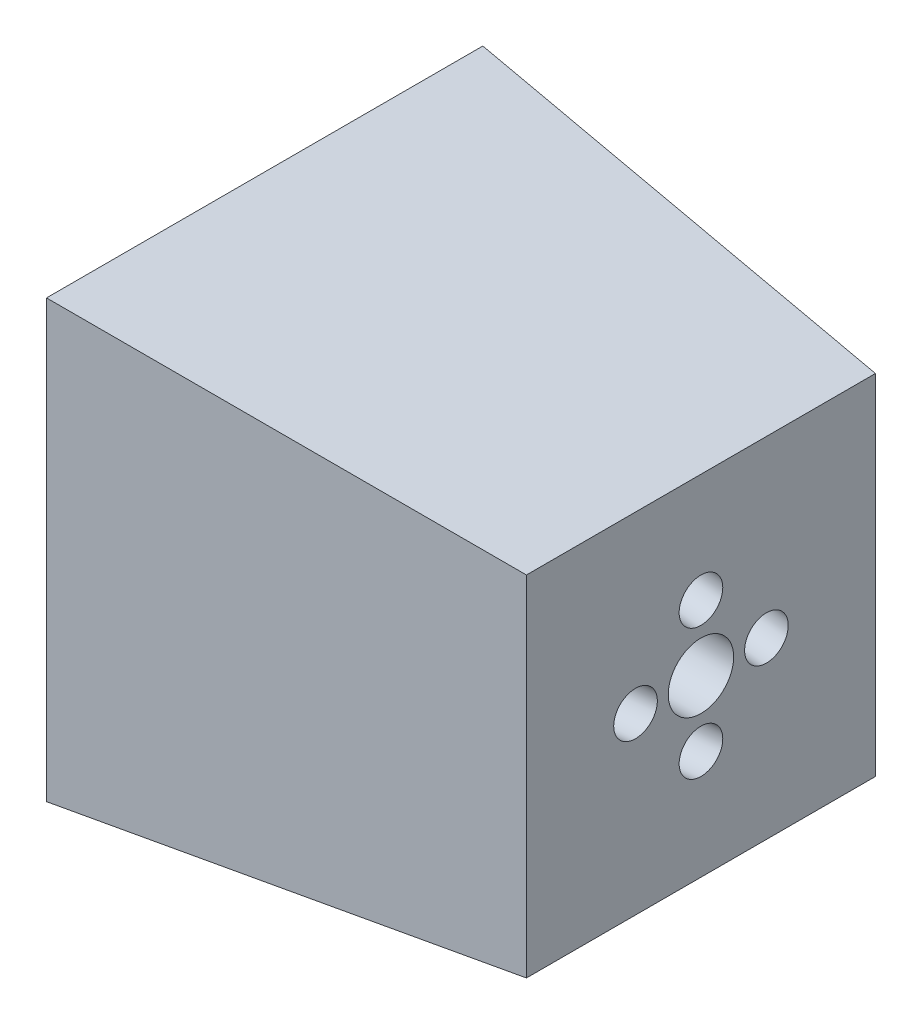
ISO-10303-21;
HEADER;
FILE_DESCRIPTION(('STEP AP214'),'2;1');
FILE_NAME('part.step','',(''),(''),'','','');
FILE_SCHEMA(('AUTOMOTIVE_DESIGN { 1 0 10303 214 1 1 1 1 }'));
ENDSEC;
DATA;
#1=APPLICATION_CONTEXT('core data for automotive mechanical design processes');
#2=APPLICATION_PROTOCOL_DEFINITION('international standard','automotive_design',2000,#1);
#3=PRODUCT_CONTEXT('',#1,'mechanical');
#4=PRODUCT('Part','Part','',(#3));
#5=PRODUCT_RELATED_PRODUCT_CATEGORY('part','',(#4));
#6=PRODUCT_DEFINITION_FORMATION('','',#4);
#7=PRODUCT_DEFINITION_CONTEXT('part definition',#1,'design');
#8=PRODUCT_DEFINITION('design','',#6,#7);
#9=PRODUCT_DEFINITION_SHAPE('','',#8);
#10=(LENGTH_UNIT() NAMED_UNIT(*) SI_UNIT(.MILLI.,.METRE.));
#11=(NAMED_UNIT(*) PLANE_ANGLE_UNIT() SI_UNIT($,.RADIAN.));
#12=(NAMED_UNIT(*) SI_UNIT($,.STERADIAN.) SOLID_ANGLE_UNIT());
#13=UNCERTAINTY_MEASURE_WITH_UNIT(LENGTH_MEASURE(1.E-05),#10,'distance_accuracy_value','');
#14=(GEOMETRIC_REPRESENTATION_CONTEXT(3) GLOBAL_UNCERTAINTY_ASSIGNED_CONTEXT((#13)) GLOBAL_UNIT_ASSIGNED_CONTEXT((#10,
#11,#12)) REPRESENTATION_CONTEXT('',''));
#15=CARTESIAN_POINT('',(0.,0.,0.));
#16=DIRECTION('',(0.,0.,1.));
#17=DIRECTION('',(1.,0.,0.));
#18=AXIS2_PLACEMENT_3D('',#15,#16,#17);
#19=CARTESIAN_POINT('',(-100.,0.,0.));
#20=DIRECTION('',(-1.,0.,0.));
#21=DIRECTION('',(0.,0.,1.));
#22=AXIS2_PLACEMENT_3D('',#19,#20,#21);
#23=PLANE('',#22);
#24=CARTESIAN_POINT('',(-100.,0.,0.));
#25=DIRECTION('',(-1.,0.,0.));
#26=DIRECTION('',(0.,0.,1.));
#27=AXIS2_PLACEMENT_3D('',#24,#25,#26);
#28=CIRCLE('',#27,7.5);
#29=CARTESIAN_POINT('',(-100.,0.,7.5));
#30=VERTEX_POINT('',#29);
#31=EDGE_CURVE('E261',#30,#30,#28,.T.);
#32=ORIENTED_EDGE('',*,*,#31,.F.);
#33=EDGE_LOOP('',(#32));
#34=FACE_BOUND('',#33,.T.);
#35=CARTESIAN_POINT('',(-100.,0.,30.));
#36=CARTESIAN_POINT('',(-100.,0.1385285597722,30.0000003298171));
#37=CARTESIAN_POINT('',(-100.,0.277059840437409,29.9942395939713));
#38=CARTESIAN_POINT('',(-100.,0.553216965321283,29.9712328197264));
#39=CARTESIAN_POINT('',(-100.,0.690842445484033,29.9539824179015));
#40=CARTESIAN_POINT('',(-100.,0.964134984880487,29.9081192702556));
#41=CARTESIAN_POINT('',(-100.,1.09980274929102,29.8795107271997));
#42=CARTESIAN_POINT('',(-100.,1.36834298276902,29.8111165305056));
#43=CARTESIAN_POINT('',(-100.,1.50121442896932,29.7713268607555));
#44=CARTESIAN_POINT('',(-100.,1.76314651576361,29.6808658808765));
#45=CARTESIAN_POINT('',(-100.,1.89220850790447,29.6301984841238));
#46=CARTESIAN_POINT('',(-100.,2.14572590134344,29.5183033445398));
#47=CARTESIAN_POINT('',(-100.,2.27017963256984,29.4570718178089));
#48=CARTESIAN_POINT('',(-100.,2.51352792657696,29.3245078801161));
#49=CARTESIAN_POINT('',(-100.,2.63242446784614,29.2531791010129));
#50=CARTESIAN_POINT('',(-100.,2.86392672172822,29.1008692351718));
#51=CARTESIAN_POINT('',(-100.,2.97653016135156,29.0198846935649));
#52=CARTESIAN_POINT('',(-100.,3.19458281353073,28.8488740810886));
#53=CARTESIAN_POINT('',(-100.,3.30003457819726,28.7588512643216));
#54=CARTESIAN_POINT('',(-100.,3.50313654992571,28.570327584903));
#55=CARTESIAN_POINT('',(-100.,3.60078394357853,28.4718236912399));
#56=CARTESIAN_POINT('',(-100.,3.78752676708732,28.2670831077229));
#57=CARTESIAN_POINT('',(-100.,3.87662525240745,28.1608492047004));
#58=CARTESIAN_POINT('',(-100.,4.0457251141882,27.9413114512762));
#59=CARTESIAN_POINT('',(-100.,4.12572321439968,27.8280050772917));
#60=CARTESIAN_POINT('',(-100.,4.27600558810493,27.5951815442083));
#61=CARTESIAN_POINT('',(-100.,4.34629333615362,27.4756666278215));
#62=CARTESIAN_POINT('',(-100.,4.47672708609248,27.2311699564562));
#63=CARTESIAN_POINT('',(-100.,4.53686943925657,27.1061862549297));
#64=CARTESIAN_POINT('',(-100.,4.64654636397009,26.8517013366476));
#65=CARTESIAN_POINT('',(-100.,4.69608473333762,26.7222017566435));
#66=CARTESIAN_POINT('',(-100.,4.7842548584075,26.4594898104109));
#67=CARTESIAN_POINT('',(-100.,4.82288269356029,26.3262761284153));
#68=CARTESIAN_POINT('',(-100.,4.88892903017654,26.0571485181558));
#69=CARTESIAN_POINT('',(-100.,4.91635154803485,25.9212355757545));
#70=CARTESIAN_POINT('',(-100.,4.95982657169531,25.6475555997026));
#71=CARTESIAN_POINT('',(-100.,4.97587499349174,25.5097879181601));
#72=CARTESIAN_POINT('',(-100.,4.99646769365315,25.2334356954908));
#73=CARTESIAN_POINT('',(-100.,5.00101609708246,25.0948514651447));
#74=CARTESIAN_POINT('',(-100.,4.99860214578275,24.8177699306864));
#75=CARTESIAN_POINT('',(-100.,4.99163565948306,24.6792726756194));
#76=CARTESIAN_POINT('',(-100.,4.953482728418,24.2654535252476));
#77=CARTESIAN_POINT('',(-100.,4.90506430050005,23.9915124524441));
#78=CARTESIAN_POINT('',(-100.,4.7635758305878,23.4555680393227));
#79=CARTESIAN_POINT('',(-100.,4.67050578859349,23.1935646990047));
#80=CARTESIAN_POINT('',(-100.,4.44228191414583,22.6885353161968));
#81=CARTESIAN_POINT('',(-100.,4.30712808169248,22.4455092737069));
#82=CARTESIAN_POINT('',(-100.,3.9984641314033,21.9851875392002));
#83=CARTESIAN_POINT('',(-100.,3.82495401356748,21.7678918471833));
#84=CARTESIAN_POINT('',(-100.,3.44436319647967,21.3650107092301));
#85=CARTESIAN_POINT('',(-100.,3.23728249722768,21.1794252632938));
#86=CARTESIAN_POINT('',(-100.,2.79526206835771,20.8450869106089));
#87=CARTESIAN_POINT('',(-100.,2.56032233873973,20.6963340038604));
#88=CARTESIAN_POINT('',(-100.,2.06906381021704,20.4397625736148));
#89=CARTESIAN_POINT('',(-100.,1.81274501131234,20.3319440501178));
#90=CARTESIAN_POINT('',(-100.,1.28579796366701,20.1602154257565));
#91=CARTESIAN_POINT('',(-100.,1.01516971492638,20.0963053248923));
#92=CARTESIAN_POINT('',(-100.,0.467068062566381,20.0141562040276));
#93=CARTESIAN_POINT('',(-100.,0.189594658947005,19.9959171840272));
#94=CARTESIAN_POINT('',(-100.,-0.364544209932437,20.0056133003615));
#95=CARTESIAN_POINT('',(-100.,-0.641209675192503,20.0335484366962));
#96=CARTESIAN_POINT('',(-100.,-1.18610185804873,20.1348223717362));
#97=CARTESIAN_POINT('',(-100.,-1.45432857564489,20.2081611704414));
#98=CARTESIAN_POINT('',(-100.,-1.97494520601807,20.39821964788));
#99=CARTESIAN_POINT('',(-100.,-2.22733511879508,20.5149393266133));
#100=CARTESIAN_POINT('',(-100.,-2.70931688295294,20.7885402764902));
#101=CARTESIAN_POINT('',(-100.,-2.9389087343338,20.9454215476337));
#102=CARTESIAN_POINT('',(-100.,-3.36896192062004,21.2950186839019));
#103=CARTESIAN_POINT('',(-100.,-3.56942325552542,21.4877345490265));
#104=CARTESIAN_POINT('',(-100.,-3.93568641299086,21.9036855079341));
#105=CARTESIAN_POINT('',(-100.,-4.10148823555092,22.126920601717));
#106=CARTESIAN_POINT('',(-100.,-4.39385932887064,22.5977528908831));
#107=CARTESIAN_POINT('',(-100.,-4.52042859963031,22.8453500862662));
#108=CARTESIAN_POINT('',(-100.,-4.73084363698726,23.3580775116863));
#109=CARTESIAN_POINT('',(-100.,-4.81468940358455,23.6232077417231));
#110=CARTESIAN_POINT('',(-100.,-4.9373448524081,24.1636885847121));
#111=CARTESIAN_POINT('',(-100.,-4.97615453463438,24.4390391976642));
#112=CARTESIAN_POINT('',(-100.,-5.00766739131245,24.9923662622782));
#113=CARTESIAN_POINT('',(-100.,-5.00037056576426,25.2703427139401));
#114=CARTESIAN_POINT('',(-100.,-4.93987166197812,25.8212544891561));
#115=CARTESIAN_POINT('',(-100.,-4.88666958374017,26.0941898127102));
#116=CARTESIAN_POINT('',(-100.,-4.73582756490298,26.627491400135));
#117=CARTESIAN_POINT('',(-100.,-4.63818762430373,26.8878576640057));
#118=CARTESIAN_POINT('',(-100.,-4.40116290516969,27.3888398943106));
#119=CARTESIAN_POINT('',(-100.,-4.26177812663489,27.6294558607448));
#120=CARTESIAN_POINT('',(-100.,-3.94510821935052,28.0843009160245));
#121=CARTESIAN_POINT('',(-100.,-3.76782309060096,28.29853000487));
#122=CARTESIAN_POINT('',(-100.,-3.38024200036277,28.69469281836));
#123=CARTESIAN_POINT('',(-100.,-3.16994603887416,28.8766265430046));
#124=CARTESIAN_POINT('',(-100.,-2.72214445377659,29.2031797434366));
#125=CARTESIAN_POINT('',(-100.,-2.48463883016764,29.3477992192241));
#126=CARTESIAN_POINT('',(-100.,-1.98896520609131,29.5957384995294));
#127=CARTESIAN_POINT('',(-100.,-1.73079720562393,29.6990583040472));
#128=CARTESIAN_POINT('',(-100.,-1.23138937391067,29.8521965812933));
#129=CARTESIAN_POINT('',(-100.,-0.991615447864765,29.9068001624825));
#130=CARTESIAN_POINT('',(-100.,-0.625689194239153,29.9622760170203));
#131=CARTESIAN_POINT('',(-100.,-0.501414470705671,29.9763662784638));
#132=CARTESIAN_POINT('',(-100.,-0.251430006043848,29.9952547298808));
#133=CARTESIAN_POINT('',(-100.,-0.125716123452088,29.9999997006875));
#134=CARTESIAN_POINT('',(-100.,0.,30.));
#135=B_SPLINE_CURVE_WITH_KNOTS('',3,(#35,#36,#37,#38,#39,#40,#41,#42,#43,#44,#45,#46,#47,#48,
#49,#50,#51,#52,#53,#54,#55,#56,#57,#58,#59,#60,#61,#62,#63,#64,#65,#66,#67,#68,#69,#70,#71,#72,
#73,#74,#75,#76,#77,#78,#79,#80,#81,#82,#83,#84,#85,#86,#87,#88,#89,#90,#91,#92,#93,#94,#95,#96,
#97,#98,#99,#100,#101,#102,#103,#104,#105,#106,#107,#108,#109,#110,#111,#112,#113,#114,#115,
#116,#117,#118,#119,#120,#121,#122,#123,#124,#125,#126,#127,#128,#129,#130,#131,#132,#133,#134),
.UNSPECIFIED.,.T.,.F.,(4,2,2,2,2,2,2,2,2,2,2,2,2,2,2,2,2,2,2,2,2,2,2,2,2,2,2,2,2,2,2,2,2,2,2,2,
2,2,2,2,2,2,2,2,2,2,2,2,2,4),(0.,0.415470913561702,0.831099700376822,1.24657483840776,
1.66219940075635,2.07767468763347,2.49329910113596,2.90877439766641,3.32439880151558,
3.73987409870045,4.15549850189521,4.57097379912327,4.98659820227483,5.40207349950564,
5.81769790265445,6.23317319988543,6.64879760303407,7.06427290026507,7.4798973034137,
7.89537260064469,8.31099700379332,9.14137881569243,9.97176062759153,10.8021424394906,
11.6325242513897,12.4629060632889,13.293287875188,14.1236696870871,14.9540514989862,
15.7844333108853,16.6148151227844,17.4451969346835,18.2755787465826,19.1059605584817,
19.9363423703808,20.7667241822799,21.597105994179,22.4274878060781,23.2578696179772,
24.0882514298763,24.9186332417755,25.7490150536746,26.5793968655737,27.4097786774728,
28.2401604893719,29.070542301271,29.9009241131701,30.6358438530342,31.0107591240888,
31.3878033433167),.UNSPECIFIED.);
#136=CARTESIAN_POINT('',(-100.,0.,30.));
#137=VERTEX_POINT('',#136);
#138=EDGE_CURVE('E265',#137,#137,#135,.T.);
#139=ORIENTED_EDGE('',*,*,#138,.F.);
#140=EDGE_LOOP('',(#139));
#141=FACE_BOUND('',#140,.T.);
#142=CARTESIAN_POINT('',(-100.,25.,-5.));
#143=CARTESIAN_POINT('',(-100.,25.1385285597722,-5.00000032981713));
#144=CARTESIAN_POINT('',(-100.,25.2770598404374,-4.99423959397131));
#145=CARTESIAN_POINT('',(-100.,25.5532169653213,-4.9712328197264));
#146=CARTESIAN_POINT('',(-100.,25.690842445484,-4.95398241790152));
#147=CARTESIAN_POINT('',(-100.,25.9641349848805,-4.90811927025558));
#148=CARTESIAN_POINT('',(-100.,26.099802749291,-4.87951072719966));
#149=CARTESIAN_POINT('',(-100.,26.368342982769,-4.81111653050565));
#150=CARTESIAN_POINT('',(-100.,26.5012144289693,-4.77132686075554));
#151=CARTESIAN_POINT('',(-100.,26.7631465157636,-4.68086588087653));
#152=CARTESIAN_POINT('',(-100.,26.8922085079045,-4.63019848412383));
#153=CARTESIAN_POINT('',(-100.,27.1457259013434,-4.51830334453981));
#154=CARTESIAN_POINT('',(-100.,27.2701796325698,-4.45707181780893));
#155=CARTESIAN_POINT('',(-100.,27.513527926577,-4.32450788011613));
#156=CARTESIAN_POINT('',(-100.,27.6324244678461,-4.25317910101292));
#157=CARTESIAN_POINT('',(-100.,27.8639267217282,-4.10086923517183));
#158=CARTESIAN_POINT('',(-100.,27.9765301613516,-4.01988469356487));
#159=CARTESIAN_POINT('',(-100.,28.1945828135307,-3.84887408108859));
#160=CARTESIAN_POINT('',(-100.,28.3000345781973,-3.75885126432159));
#161=CARTESIAN_POINT('',(-100.,28.5031365499257,-3.57032758490296));
#162=CARTESIAN_POINT('',(-100.,28.6007839435785,-3.47182369123993));
#163=CARTESIAN_POINT('',(-100.,28.7875267670873,-3.26708310772286));
#164=CARTESIAN_POINT('',(-100.,28.8766252524075,-3.16084920470042));
#165=CARTESIAN_POINT('',(-100.,29.0457251141882,-2.94131145127625));
#166=CARTESIAN_POINT('',(-100.,29.1257232143997,-2.82800507729167));
#167=CARTESIAN_POINT('',(-100.,29.2760055881049,-2.59518154420831));
#168=CARTESIAN_POINT('',(-100.,29.3462933361536,-2.47566662782149));
#169=CARTESIAN_POINT('',(-100.,29.4767270860925,-2.23116995645618));
#170=CARTESIAN_POINT('',(-100.,29.5368694392566,-2.10618625492971));
#171=CARTESIAN_POINT('',(-100.,29.6465463639701,-1.85170133664759));
#172=CARTESIAN_POINT('',(-100.,29.6960847333376,-1.72220175664349));
#173=CARTESIAN_POINT('',(-100.,29.7842548584075,-1.45948981041091));
#174=CARTESIAN_POINT('',(-100.,29.8228826935603,-1.32627612841534));
#175=CARTESIAN_POINT('',(-100.,29.8889290301766,-1.05714851815583));
#176=CARTESIAN_POINT('',(-100.,29.9163515480349,-0.921235575754491));
#177=CARTESIAN_POINT('',(-100.,29.9598265716953,-0.647555599702637));
#178=CARTESIAN_POINT('',(-100.,29.9758749934917,-0.509787918160133));
#179=CARTESIAN_POINT('',(-100.,29.9964676936532,-0.233435695490765));
#180=CARTESIAN_POINT('',(-100.,30.0010160970825,-0.0948514651446539));
#181=CARTESIAN_POINT('',(-100.,29.9986021457828,0.182230069313587));
#182=CARTESIAN_POINT('',(-100.,29.9916356594831,0.32072732438063));
#183=CARTESIAN_POINT('',(-100.,29.953482728418,0.734546474752419));
#184=CARTESIAN_POINT('',(-100.,29.9050643005001,1.00848754755588));
#185=CARTESIAN_POINT('',(-100.,29.7635758305878,1.54443196067731));
#186=CARTESIAN_POINT('',(-100.,29.6705057885935,1.80643530099529));
#187=CARTESIAN_POINT('',(-100.,29.4422819141458,2.31146468380316));
#188=CARTESIAN_POINT('',(-100.,29.3071280816925,2.55449072629306));
#189=CARTESIAN_POINT('',(-100.,28.9984641314033,3.01481246079981));
#190=CARTESIAN_POINT('',(-100.,28.8249540135675,3.23210815281666));
#191=CARTESIAN_POINT('',(-100.,28.4443631964797,3.63498929076987));
#192=CARTESIAN_POINT('',(-100.,28.2372824972277,3.82057473670622));
#193=CARTESIAN_POINT('',(-100.,27.7952620683577,4.15491308939111));
#194=CARTESIAN_POINT('',(-100.,27.5603223387397,4.30366599613965));
#195=CARTESIAN_POINT('',(-100.,27.069063810217,4.5602374263852));
#196=CARTESIAN_POINT('',(-100.,26.8127450113123,4.66805594988221));
#197=CARTESIAN_POINT('',(-100.,26.285797963667,4.83978457424347));
#198=CARTESIAN_POINT('',(-100.,26.0151697149264,4.90369467510771));
#199=CARTESIAN_POINT('',(-100.,25.4670680625664,4.9858437959724));
#200=CARTESIAN_POINT('',(-100.,25.189594658947,5.00408281597285));
#201=CARTESIAN_POINT('',(-100.,24.6354557900675,4.99438669963854));
#202=CARTESIAN_POINT('',(-100.,24.3587903248075,4.96645156330378));
#203=CARTESIAN_POINT('',(-100.,23.8138981419512,4.86517762826379));
#204=CARTESIAN_POINT('',(-100.,23.5456714243551,4.79183882955855));
#205=CARTESIAN_POINT('',(-100.,23.0250547939819,4.60178035211999));
#206=CARTESIAN_POINT('',(-100.,22.7726648812049,4.48506067338668));
#207=CARTESIAN_POINT('',(-100.,22.290683117047,4.21145972350983));
#208=CARTESIAN_POINT('',(-100.,22.0610912656662,4.05457845236631));
#209=CARTESIAN_POINT('',(-100.,21.6310380793799,3.70498131609813));
#210=CARTESIAN_POINT('',(-100.,21.4305767444746,3.51226545097349));
#211=CARTESIAN_POINT('',(-100.,21.0643135870091,3.09631449206593));
#212=CARTESIAN_POINT('',(-100.,20.8985117644491,2.87307939828301));
#213=CARTESIAN_POINT('',(-100.,20.6061406711294,2.40224710911692));
#214=CARTESIAN_POINT('',(-100.,20.4795714003697,2.15464991373375));
#215=CARTESIAN_POINT('',(-100.,20.2691563630127,1.64192248831372));
#216=CARTESIAN_POINT('',(-100.,20.1853105964154,1.37679225827685));
#217=CARTESIAN_POINT('',(-100.,20.0626551475919,0.836311415287869));
#218=CARTESIAN_POINT('',(-100.,20.0238454653656,0.560960802335754));
#219=CARTESIAN_POINT('',(-100.,19.9923326086875,0.00763373772176817));
#220=CARTESIAN_POINT('',(-100.,19.9996294342357,-0.270342713940101));
#221=CARTESIAN_POINT('',(-100.,20.0601283380219,-0.821254489156099));
#222=CARTESIAN_POINT('',(-100.,20.1133304162598,-1.09418981271023));
#223=CARTESIAN_POINT('',(-100.,20.264172435097,-1.62749140013504));
#224=CARTESIAN_POINT('',(-100.,20.3618123756963,-1.88785766400572));
#225=CARTESIAN_POINT('',(-100.,20.5988370948303,-2.38883989431064));
#226=CARTESIAN_POINT('',(-100.,20.7382218733651,-2.62945586074488));
#227=CARTESIAN_POINT('',(-100.,21.0548917806495,-3.08430091602458));
#228=CARTESIAN_POINT('',(-100.,21.2321769093991,-3.29853000487005));
#229=CARTESIAN_POINT('',(-100.,21.6197579996373,-3.69469281836006));
#230=CARTESIAN_POINT('',(-100.,21.8300539611259,-3.8766265430046));
#231=CARTESIAN_POINT('',(-100.,22.2778555462234,-4.20317974343665));
#232=CARTESIAN_POINT('',(-100.,22.5153611698324,-4.34779921922415));
#233=CARTESIAN_POINT('',(-100.,23.0110347939087,-4.59573849952946));
#234=CARTESIAN_POINT('',(-100.,23.2692027943761,-4.69905830404726));
#235=CARTESIAN_POINT('',(-100.,23.7686106260894,-4.85219658129331));
#236=CARTESIAN_POINT('',(-100.,24.0083845521353,-4.90680016248248));
#237=CARTESIAN_POINT('',(-100.,24.3743108057609,-4.96227601702033));
#238=CARTESIAN_POINT('',(-100.,24.4985855292944,-4.97636627846384));
#239=CARTESIAN_POINT('',(-100.,24.7485699939562,-4.99525472988085));
#240=CARTESIAN_POINT('',(-100.,24.8742838765479,-4.99999970068749));
#241=CARTESIAN_POINT('',(-100.,25.,-5.));
#242=B_SPLINE_CURVE_WITH_KNOTS('',3,(#142,#143,#144,#145,#146,#147,#148,#149,#150,#151,#152,
#153,#154,#155,#156,#157,#158,#159,#160,#161,#162,#163,#164,#165,#166,#167,#168,#169,#170,#171,
#172,#173,#174,#175,#176,#177,#178,#179,#180,#181,#182,#183,#184,#185,#186,#187,#188,#189,#190,
#191,#192,#193,#194,#195,#196,#197,#198,#199,#200,#201,#202,#203,#204,#205,#206,#207,#208,#209,
#210,#211,#212,#213,#214,#215,#216,#217,#218,#219,#220,#221,#222,#223,#224,#225,#226,#227,#228,
#229,#230,#231,#232,#233,#234,#235,#236,#237,#238,#239,#240,#241),.UNSPECIFIED.,.T.,.F.,(4,2,2,
2,2,2,2,2,2,2,2,2,2,2,2,2,2,2,2,2,2,2,2,2,2,2,2,2,2,2,2,2,2,2,2,2,2,2,2,2,2,2,2,2,2,2,2,2,2,4),
(0.,0.415470913561702,0.831099700376821,1.24657483840775,1.66219940075635,2.07767468763347,
2.49329910113596,2.9087743976664,3.32439880151558,3.73987409870045,4.15549850189521,
4.57097379912328,4.98659820227483,5.40207349950565,5.81769790265446,6.23317319988543,
6.64879760303408,7.06427290026507,7.4798973034137,7.89537260064469,8.31099700379332,
9.14137881569243,9.97176062759154,10.8021424394907,11.6325242513898,12.4629060632889,
13.293287875188,14.1236696870871,14.9540514989862,15.7844333108853,16.6148151227844,
17.4451969346835,18.2755787465826,19.1059605584817,19.9363423703809,20.76672418228,
21.5971059941791,22.4274878060782,23.2578696179773,24.0882514298764,24.9186332417755,
25.7490150536746,26.5793968655737,27.4097786774728,28.2401604893719,29.0705423012711,
29.9009241131702,30.6358438530343,31.0107591240888,31.3878033433167),.UNSPECIFIED.);
#243=CARTESIAN_POINT('',(-100.,25.,-5.));
#244=VERTEX_POINT('',#243);
#245=EDGE_CURVE('E269',#244,#244,#242,.T.);
#246=ORIENTED_EDGE('',*,*,#245,.T.);
#247=EDGE_LOOP('',(#246));
#248=FACE_BOUND('',#247,.T.);
#249=CARTESIAN_POINT('',(-100.,0.,-30.));
#250=CARTESIAN_POINT('',(-100.,0.1385285597722,-30.0000003298171));
#251=CARTESIAN_POINT('',(-100.,0.277059840437409,-29.9942395939713));
#252=CARTESIAN_POINT('',(-100.,0.553216965321283,-29.9712328197264));
#253=CARTESIAN_POINT('',(-100.,0.690842445484033,-29.9539824179015));
#254=CARTESIAN_POINT('',(-100.,0.964134984880487,-29.9081192702556));
#255=CARTESIAN_POINT('',(-100.,1.09980274929102,-29.8795107271997));
#256=CARTESIAN_POINT('',(-100.,1.36834298276902,-29.8111165305056));
#257=CARTESIAN_POINT('',(-100.,1.50121442896932,-29.7713268607555));
#258=CARTESIAN_POINT('',(-100.,1.76314651576361,-29.6808658808765));
#259=CARTESIAN_POINT('',(-100.,1.89220850790447,-29.6301984841238));
#260=CARTESIAN_POINT('',(-100.,2.14572590134344,-29.5183033445398));
#261=CARTESIAN_POINT('',(-100.,2.27017963256984,-29.4570718178089));
#262=CARTESIAN_POINT('',(-100.,2.51352792657696,-29.3245078801161));
#263=CARTESIAN_POINT('',(-100.,2.63242446784614,-29.2531791010129));
#264=CARTESIAN_POINT('',(-100.,2.86392672172822,-29.1008692351718));
#265=CARTESIAN_POINT('',(-100.,2.97653016135156,-29.0198846935649));
#266=CARTESIAN_POINT('',(-100.,3.19458281353073,-28.8488740810886));
#267=CARTESIAN_POINT('',(-100.,3.30003457819726,-28.7588512643216));
#268=CARTESIAN_POINT('',(-100.,3.50313654992571,-28.570327584903));
#269=CARTESIAN_POINT('',(-100.,3.60078394357853,-28.4718236912399));
#270=CARTESIAN_POINT('',(-100.,3.78752676708732,-28.2670831077229));
#271=CARTESIAN_POINT('',(-100.,3.87662525240745,-28.1608492047004));
#272=CARTESIAN_POINT('',(-100.,4.0457251141882,-27.9413114512762));
#273=CARTESIAN_POINT('',(-100.,4.12572321439968,-27.8280050772917));
#274=CARTESIAN_POINT('',(-100.,4.27600558810493,-27.5951815442083));
#275=CARTESIAN_POINT('',(-100.,4.34629333615362,-27.4756666278215));
#276=CARTESIAN_POINT('',(-100.,4.47672708609248,-27.2311699564562));
#277=CARTESIAN_POINT('',(-100.,4.53686943925657,-27.1061862549297));
#278=CARTESIAN_POINT('',(-100.,4.64654636397009,-26.8517013366476));
#279=CARTESIAN_POINT('',(-100.,4.69608473333762,-26.7222017566435));
#280=CARTESIAN_POINT('',(-100.,4.7842548584075,-26.4594898104109));
#281=CARTESIAN_POINT('',(-100.,4.82288269356029,-26.3262761284153));
#282=CARTESIAN_POINT('',(-100.,4.88892903017654,-26.0571485181558));
#283=CARTESIAN_POINT('',(-100.,4.91635154803485,-25.9212355757545));
#284=CARTESIAN_POINT('',(-100.,4.95982657169531,-25.6475555997026));
#285=CARTESIAN_POINT('',(-100.,4.97587499349174,-25.5097879181601));
#286=CARTESIAN_POINT('',(-100.,4.99646769365315,-25.2334356954908));
#287=CARTESIAN_POINT('',(-100.,5.00101609708246,-25.0948514651447));
#288=CARTESIAN_POINT('',(-100.,4.99860214578275,-24.8177699306864));
#289=CARTESIAN_POINT('',(-100.,4.99163565948306,-24.6792726756194));
#290=CARTESIAN_POINT('',(-100.,4.953482728418,-24.2654535252476));
#291=CARTESIAN_POINT('',(-100.,4.90506430050005,-23.9915124524441));
#292=CARTESIAN_POINT('',(-100.,4.7635758305878,-23.4555680393227));
#293=CARTESIAN_POINT('',(-100.,4.67050578859349,-23.1935646990047));
#294=CARTESIAN_POINT('',(-100.,4.44228191414583,-22.6885353161968));
#295=CARTESIAN_POINT('',(-100.,4.30712808169248,-22.4455092737069));
#296=CARTESIAN_POINT('',(-100.,3.9984641314033,-21.9851875392002));
#297=CARTESIAN_POINT('',(-100.,3.82495401356748,-21.7678918471833));
#298=CARTESIAN_POINT('',(-100.,3.44436319647967,-21.3650107092301));
#299=CARTESIAN_POINT('',(-100.,3.23728249722768,-21.1794252632938));
#300=CARTESIAN_POINT('',(-100.,2.79526206835771,-20.8450869106089));
#301=CARTESIAN_POINT('',(-100.,2.56032233873973,-20.6963340038604));
#302=CARTESIAN_POINT('',(-100.,2.06906381021704,-20.4397625736148));
#303=CARTESIAN_POINT('',(-100.,1.81274501131234,-20.3319440501178));
#304=CARTESIAN_POINT('',(-100.,1.28579796366701,-20.1602154257565));
#305=CARTESIAN_POINT('',(-100.,1.01516971492638,-20.0963053248923));
#306=CARTESIAN_POINT('',(-100.,0.467068062566381,-20.0141562040276));
#307=CARTESIAN_POINT('',(-100.,0.189594658947005,-19.9959171840272));
#308=CARTESIAN_POINT('',(-100.,-0.364544209932437,-20.0056133003615));
#309=CARTESIAN_POINT('',(-100.,-0.641209675192503,-20.0335484366962));
#310=CARTESIAN_POINT('',(-100.,-1.18610185804873,-20.1348223717362));
#311=CARTESIAN_POINT('',(-100.,-1.45432857564489,-20.2081611704414));
#312=CARTESIAN_POINT('',(-100.,-1.97494520601807,-20.39821964788));
#313=CARTESIAN_POINT('',(-100.,-2.22733511879508,-20.5149393266133));
#314=CARTESIAN_POINT('',(-100.,-2.70931688295294,-20.7885402764902));
#315=CARTESIAN_POINT('',(-100.,-2.9389087343338,-20.9454215476337));
#316=CARTESIAN_POINT('',(-100.,-3.36896192062004,-21.2950186839019));
#317=CARTESIAN_POINT('',(-100.,-3.56942325552542,-21.4877345490265));
#318=CARTESIAN_POINT('',(-100.,-3.93568641299086,-21.9036855079341));
#319=CARTESIAN_POINT('',(-100.,-4.10148823555092,-22.126920601717));
#320=CARTESIAN_POINT('',(-100.,-4.39385932887064,-22.5977528908831));
#321=CARTESIAN_POINT('',(-100.,-4.52042859963031,-22.8453500862662));
#322=CARTESIAN_POINT('',(-100.,-4.73084363698726,-23.3580775116863));
#323=CARTESIAN_POINT('',(-100.,-4.81468940358455,-23.6232077417231));
#324=CARTESIAN_POINT('',(-100.,-4.9373448524081,-24.1636885847121));
#325=CARTESIAN_POINT('',(-100.,-4.97615453463438,-24.4390391976642));
#326=CARTESIAN_POINT('',(-100.,-5.00766739131245,-24.9923662622782));
#327=CARTESIAN_POINT('',(-100.,-5.00037056576426,-25.2703427139401));
#328=CARTESIAN_POINT('',(-100.,-4.93987166197812,-25.8212544891561));
#329=CARTESIAN_POINT('',(-100.,-4.88666958374017,-26.0941898127102));
#330=CARTESIAN_POINT('',(-100.,-4.73582756490298,-26.627491400135));
#331=CARTESIAN_POINT('',(-100.,-4.63818762430373,-26.8878576640057));
#332=CARTESIAN_POINT('',(-100.,-4.40116290516969,-27.3888398943106));
#333=CARTESIAN_POINT('',(-100.,-4.26177812663489,-27.6294558607448));
#334=CARTESIAN_POINT('',(-100.,-3.94510821935052,-28.0843009160245));
#335=CARTESIAN_POINT('',(-100.,-3.76782309060096,-28.29853000487));
#336=CARTESIAN_POINT('',(-100.,-3.38024200036277,-28.69469281836));
#337=CARTESIAN_POINT('',(-100.,-3.16994603887416,-28.8766265430046));
#338=CARTESIAN_POINT('',(-100.,-2.72214445377659,-29.2031797434366));
#339=CARTESIAN_POINT('',(-100.,-2.48463883016764,-29.3477992192241));
#340=CARTESIAN_POINT('',(-100.,-1.98896520609131,-29.5957384995294));
#341=CARTESIAN_POINT('',(-100.,-1.73079720562393,-29.6990583040472));
#342=CARTESIAN_POINT('',(-100.,-1.23138937391067,-29.8521965812933));
#343=CARTESIAN_POINT('',(-100.,-0.991615447864765,-29.9068001624825));
#344=CARTESIAN_POINT('',(-100.,-0.625689194239153,-29.9622760170203));
#345=CARTESIAN_POINT('',(-100.,-0.501414470705671,-29.9763662784638));
#346=CARTESIAN_POINT('',(-100.,-0.251430006043848,-29.9952547298808));
#347=CARTESIAN_POINT('',(-100.,-0.125716123452088,-29.9999997006875));
#348=CARTESIAN_POINT('',(-100.,0.,-30.));
#349=B_SPLINE_CURVE_WITH_KNOTS('',3,(#249,#250,#251,#252,#253,#254,#255,#256,#257,#258,#259,
#260,#261,#262,#263,#264,#265,#266,#267,#268,#269,#270,#271,#272,#273,#274,#275,#276,#277,#278,
#279,#280,#281,#282,#283,#284,#285,#286,#287,#288,#289,#290,#291,#292,#293,#294,#295,#296,#297,
#298,#299,#300,#301,#302,#303,#304,#305,#306,#307,#308,#309,#310,#311,#312,#313,#314,#315,#316,
#317,#318,#319,#320,#321,#322,#323,#324,#325,#326,#327,#328,#329,#330,#331,#332,#333,#334,#335,
#336,#337,#338,#339,#340,#341,#342,#343,#344,#345,#346,#347,#348),.UNSPECIFIED.,.T.,.F.,(4,2,2,
2,2,2,2,2,2,2,2,2,2,2,2,2,2,2,2,2,2,2,2,2,2,2,2,2,2,2,2,2,2,2,2,2,2,2,2,2,2,2,2,2,2,2,2,2,2,4),
(0.,0.415470913561702,0.831099700376822,1.24657483840776,1.66219940075635,2.07767468763347,
2.49329910113596,2.90877439766641,3.32439880151558,3.73987409870045,4.15549850189521,
4.57097379912327,4.98659820227483,5.40207349950564,5.81769790265445,6.23317319988543,
6.64879760303407,7.06427290026507,7.4798973034137,7.89537260064469,8.31099700379332,
9.14137881569243,9.97176062759153,10.8021424394906,11.6325242513897,12.4629060632889,
13.293287875188,14.1236696870871,14.9540514989862,15.7844333108853,16.6148151227844,
17.4451969346835,18.2755787465826,19.1059605584817,19.9363423703808,20.7667241822799,
21.597105994179,22.4274878060781,23.2578696179772,24.0882514298763,24.9186332417755,
25.7490150536746,26.5793968655737,27.4097786774728,28.2401604893719,29.070542301271,
29.9009241131701,30.6358438530342,31.0107591240888,31.3878033433167),.UNSPECIFIED.);
#350=CARTESIAN_POINT('',(-100.,0.,-30.));
#351=VERTEX_POINT('',#350);
#352=EDGE_CURVE('E116',#351,#351,#349,.T.);
#353=ORIENTED_EDGE('',*,*,#352,.T.);
#354=EDGE_LOOP('',(#353));
#355=FACE_BOUND('',#354,.T.);
#356=DIRECTION('',(0.,-1.,0.));
#357=VECTOR('',#356,1.);
#358=CARTESIAN_POINT('',(-100.,50.,50.));
#359=LINE('',#358,#357);
#360=CARTESIAN_POINT('',(-100.,50.,50.));
#361=VERTEX_POINT('',#360);
#362=CARTESIAN_POINT('',(-100.,-50.,50.));
#363=VERTEX_POINT('',#362);
#364=EDGE_CURVE('E95',#361,#363,#359,.T.);
#365=ORIENTED_EDGE('',*,*,#364,.F.);
#366=DIRECTION('',(0.,0.,1.));
#367=VECTOR('',#366,1.);
#368=CARTESIAN_POINT('',(-100.,50.,-50.));
#369=LINE('',#368,#367);
#370=CARTESIAN_POINT('',(-100.,50.,-50.));
#371=VERTEX_POINT('',#370);
#372=EDGE_CURVE('E85',#371,#361,#369,.T.);
#373=ORIENTED_EDGE('',*,*,#372,.F.);
#374=DIRECTION('',(0.,1.,0.));
#375=VECTOR('',#374,1.);
#376=CARTESIAN_POINT('',(-100.,50.,-50.));
#377=LINE('',#376,#375);
#378=CARTESIAN_POINT('',(-100.,-50.,-50.));
#379=VERTEX_POINT('',#378);
#380=EDGE_CURVE('E108',#379,#371,#377,.T.);
#381=ORIENTED_EDGE('',*,*,#380,.F.);
#382=DIRECTION('',(0.,0.,-1.));
#383=VECTOR('',#382,1.);
#384=CARTESIAN_POINT('',(-100.,-50.,-50.));
#385=LINE('',#384,#383);
#386=EDGE_CURVE('E114',#363,#379,#385,.T.);
#387=ORIENTED_EDGE('',*,*,#386,.F.);
#388=EDGE_LOOP('',(#365,#373,#381,#387));
#389=FACE_BOUND('',#388,.T.);
#390=CARTESIAN_POINT('',(-100.,-25.,-5.));
#391=CARTESIAN_POINT('',(-100.,-25.1385285597722,-5.00000032981713));
#392=CARTESIAN_POINT('',(-100.,-25.2770598404374,-4.99423959397131));
#393=CARTESIAN_POINT('',(-100.,-25.5532169653213,-4.9712328197264));
#394=CARTESIAN_POINT('',(-100.,-25.690842445484,-4.95398241790152));
#395=CARTESIAN_POINT('',(-100.,-25.9641349848805,-4.90811927025558));
#396=CARTESIAN_POINT('',(-100.,-26.099802749291,-4.87951072719966));
#397=CARTESIAN_POINT('',(-100.,-26.368342982769,-4.81111653050565));
#398=CARTESIAN_POINT('',(-100.,-26.5012144289693,-4.77132686075554));
#399=CARTESIAN_POINT('',(-100.,-26.7631465157636,-4.68086588087653));
#400=CARTESIAN_POINT('',(-100.,-26.8922085079045,-4.63019848412383));
#401=CARTESIAN_POINT('',(-100.,-27.1457259013434,-4.51830334453981));
#402=CARTESIAN_POINT('',(-100.,-27.2701796325698,-4.45707181780893));
#403=CARTESIAN_POINT('',(-100.,-27.513527926577,-4.32450788011613));
#404=CARTESIAN_POINT('',(-100.,-27.6324244678461,-4.25317910101292));
#405=CARTESIAN_POINT('',(-100.,-27.8639267217282,-4.10086923517183));
#406=CARTESIAN_POINT('',(-100.,-27.9765301613516,-4.01988469356487));
#407=CARTESIAN_POINT('',(-100.,-28.1945828135307,-3.84887408108859));
#408=CARTESIAN_POINT('',(-100.,-28.3000345781973,-3.75885126432159));
#409=CARTESIAN_POINT('',(-100.,-28.5031365499257,-3.57032758490296));
#410=CARTESIAN_POINT('',(-100.,-28.6007839435785,-3.47182369123993));
#411=CARTESIAN_POINT('',(-100.,-28.7875267670873,-3.26708310772286));
#412=CARTESIAN_POINT('',(-100.,-28.8766252524075,-3.16084920470042));
#413=CARTESIAN_POINT('',(-100.,-29.0457251141882,-2.94131145127625));
#414=CARTESIAN_POINT('',(-100.,-29.1257232143997,-2.82800507729167));
#415=CARTESIAN_POINT('',(-100.,-29.2760055881049,-2.59518154420831));
#416=CARTESIAN_POINT('',(-100.,-29.3462933361536,-2.47566662782149));
#417=CARTESIAN_POINT('',(-100.,-29.4767270860925,-2.23116995645618));
#418=CARTESIAN_POINT('',(-100.,-29.5368694392566,-2.10618625492971));
#419=CARTESIAN_POINT('',(-100.,-29.6465463639701,-1.85170133664759));
#420=CARTESIAN_POINT('',(-100.,-29.6960847333376,-1.72220175664349));
#421=CARTESIAN_POINT('',(-100.,-29.7842548584075,-1.45948981041091));
#422=CARTESIAN_POINT('',(-100.,-29.8228826935603,-1.32627612841534));
#423=CARTESIAN_POINT('',(-100.,-29.8889290301766,-1.05714851815583));
#424=CARTESIAN_POINT('',(-100.,-29.9163515480349,-0.921235575754491));
#425=CARTESIAN_POINT('',(-100.,-29.9598265716953,-0.647555599702637));
#426=CARTESIAN_POINT('',(-100.,-29.9758749934917,-0.509787918160133));
#427=CARTESIAN_POINT('',(-100.,-29.9964676936532,-0.233435695490765));
#428=CARTESIAN_POINT('',(-100.,-30.0010160970825,-0.0948514651446539));
#429=CARTESIAN_POINT('',(-100.,-29.9986021457828,0.182230069313587));
#430=CARTESIAN_POINT('',(-100.,-29.9916356594831,0.32072732438063));
#431=CARTESIAN_POINT('',(-100.,-29.953482728418,0.734546474752419));
#432=CARTESIAN_POINT('',(-100.,-29.9050643005001,1.00848754755588));
#433=CARTESIAN_POINT('',(-100.,-29.7635758305878,1.54443196067731));
#434=CARTESIAN_POINT('',(-100.,-29.6705057885935,1.80643530099529));
#435=CARTESIAN_POINT('',(-100.,-29.4422819141458,2.31146468380316));
#436=CARTESIAN_POINT('',(-100.,-29.3071280816925,2.55449072629306));
#437=CARTESIAN_POINT('',(-100.,-28.9984641314033,3.01481246079981));
#438=CARTESIAN_POINT('',(-100.,-28.8249540135675,3.23210815281666));
#439=CARTESIAN_POINT('',(-100.,-28.4443631964797,3.63498929076987));
#440=CARTESIAN_POINT('',(-100.,-28.2372824972277,3.82057473670622));
#441=CARTESIAN_POINT('',(-100.,-27.7952620683577,4.15491308939111));
#442=CARTESIAN_POINT('',(-100.,-27.5603223387397,4.30366599613965));
#443=CARTESIAN_POINT('',(-100.,-27.069063810217,4.5602374263852));
#444=CARTESIAN_POINT('',(-100.,-26.8127450113123,4.66805594988221));
#445=CARTESIAN_POINT('',(-100.,-26.285797963667,4.83978457424347));
#446=CARTESIAN_POINT('',(-100.,-26.0151697149264,4.90369467510771));
#447=CARTESIAN_POINT('',(-100.,-25.4670680625664,4.9858437959724));
#448=CARTESIAN_POINT('',(-100.,-25.189594658947,5.00408281597285));
#449=CARTESIAN_POINT('',(-100.,-24.6354557900675,4.99438669963854));
#450=CARTESIAN_POINT('',(-100.,-24.3587903248075,4.96645156330378));
#451=CARTESIAN_POINT('',(-100.,-23.8138981419512,4.86517762826379));
#452=CARTESIAN_POINT('',(-100.,-23.5456714243551,4.79183882955855));
#453=CARTESIAN_POINT('',(-100.,-23.0250547939819,4.60178035211999));
#454=CARTESIAN_POINT('',(-100.,-22.7726648812049,4.48506067338668));
#455=CARTESIAN_POINT('',(-100.,-22.290683117047,4.21145972350983));
#456=CARTESIAN_POINT('',(-100.,-22.0610912656662,4.05457845236631));
#457=CARTESIAN_POINT('',(-100.,-21.6310380793799,3.70498131609813));
#458=CARTESIAN_POINT('',(-100.,-21.4305767444746,3.51226545097349));
#459=CARTESIAN_POINT('',(-100.,-21.0643135870091,3.09631449206593));
#460=CARTESIAN_POINT('',(-100.,-20.8985117644491,2.87307939828301));
#461=CARTESIAN_POINT('',(-100.,-20.6061406711294,2.40224710911692));
#462=CARTESIAN_POINT('',(-100.,-20.4795714003697,2.15464991373375));
#463=CARTESIAN_POINT('',(-100.,-20.2691563630127,1.64192248831372));
#464=CARTESIAN_POINT('',(-100.,-20.1853105964154,1.37679225827685));
#465=CARTESIAN_POINT('',(-100.,-20.0626551475919,0.836311415287869));
#466=CARTESIAN_POINT('',(-100.,-20.0238454653656,0.560960802335754));
#467=CARTESIAN_POINT('',(-100.,-19.9923326086875,0.00763373772176817));
#468=CARTESIAN_POINT('',(-100.,-19.9996294342357,-0.270342713940101));
#469=CARTESIAN_POINT('',(-100.,-20.0601283380219,-0.821254489156099));
#470=CARTESIAN_POINT('',(-100.,-20.1133304162598,-1.09418981271023));
#471=CARTESIAN_POINT('',(-100.,-20.264172435097,-1.62749140013504));
#472=CARTESIAN_POINT('',(-100.,-20.3618123756963,-1.88785766400572));
#473=CARTESIAN_POINT('',(-100.,-20.5988370948303,-2.38883989431064));
#474=CARTESIAN_POINT('',(-100.,-20.7382218733651,-2.62945586074488));
#475=CARTESIAN_POINT('',(-100.,-21.0548917806495,-3.08430091602458));
#476=CARTESIAN_POINT('',(-100.,-21.2321769093991,-3.29853000487005));
#477=CARTESIAN_POINT('',(-100.,-21.6197579996373,-3.69469281836006));
#478=CARTESIAN_POINT('',(-100.,-21.8300539611259,-3.8766265430046));
#479=CARTESIAN_POINT('',(-100.,-22.2778555462234,-4.20317974343665));
#480=CARTESIAN_POINT('',(-100.,-22.5153611698324,-4.34779921922415));
#481=CARTESIAN_POINT('',(-100.,-23.0110347939087,-4.59573849952946));
#482=CARTESIAN_POINT('',(-100.,-23.2692027943761,-4.69905830404726));
#483=CARTESIAN_POINT('',(-100.,-23.7686106260894,-4.85219658129331));
#484=CARTESIAN_POINT('',(-100.,-24.0083845521353,-4.90680016248248));
#485=CARTESIAN_POINT('',(-100.,-24.3743108057609,-4.96227601702033));
#486=CARTESIAN_POINT('',(-100.,-24.4985855292944,-4.97636627846384));
#487=CARTESIAN_POINT('',(-100.,-24.7485699939562,-4.99525472988085));
#488=CARTESIAN_POINT('',(-100.,-24.8742838765479,-4.99999970068749));
#489=CARTESIAN_POINT('',(-100.,-25.,-5.));
#490=B_SPLINE_CURVE_WITH_KNOTS('',3,(#390,#391,#392,#393,#394,#395,#396,#397,#398,#399,#400,
#401,#402,#403,#404,#405,#406,#407,#408,#409,#410,#411,#412,#413,#414,#415,#416,#417,#418,#419,
#420,#421,#422,#423,#424,#425,#426,#427,#428,#429,#430,#431,#432,#433,#434,#435,#436,#437,#438,
#439,#440,#441,#442,#443,#444,#445,#446,#447,#448,#449,#450,#451,#452,#453,#454,#455,#456,#457,
#458,#459,#460,#461,#462,#463,#464,#465,#466,#467,#468,#469,#470,#471,#472,#473,#474,#475,#476,
#477,#478,#479,#480,#481,#482,#483,#484,#485,#486,#487,#488,#489),.UNSPECIFIED.,.T.,.F.,(4,2,2,
2,2,2,2,2,2,2,2,2,2,2,2,2,2,2,2,2,2,2,2,2,2,2,2,2,2,2,2,2,2,2,2,2,2,2,2,2,2,2,2,2,2,2,2,2,2,4),
(0.,0.415470913561702,0.831099700376821,1.24657483840775,1.66219940075635,2.07767468763347,
2.49329910113596,2.9087743976664,3.32439880151558,3.73987409870045,4.15549850189521,
4.57097379912328,4.98659820227483,5.40207349950565,5.81769790265446,6.23317319988543,
6.64879760303408,7.06427290026507,7.4798973034137,7.89537260064469,8.31099700379332,
9.14137881569243,9.97176062759154,10.8021424394907,11.6325242513898,12.4629060632889,
13.293287875188,14.1236696870871,14.9540514989862,15.7844333108853,16.6148151227844,
17.4451969346835,18.2755787465826,19.1059605584817,19.9363423703809,20.76672418228,
21.5971059941791,22.4274878060782,23.2578696179773,24.0882514298764,24.9186332417755,
25.7490150536746,26.5793968655737,27.4097786774728,28.2401604893719,29.0705423012711,
29.9009241131702,30.6358438530343,31.0107591240888,31.3878033433167),.UNSPECIFIED.);
#491=CARTESIAN_POINT('',(-100.,-25.,-5.));
#492=VERTEX_POINT('',#491);
#493=EDGE_CURVE('E311',#492,#492,#490,.T.);
#494=ORIENTED_EDGE('',*,*,#493,.F.);
#495=EDGE_LOOP('',(#494));
#496=FACE_BOUND('',#495,.T.);
#497=ADVANCED_FACE('F45',(#34,#141,#248,#355,#389,#496),#23,.T.);
#498=CARTESIAN_POINT('',(0.,0.,0.));
#499=DIRECTION('',(-1.,0.,0.));
#500=DIRECTION('',(0.,0.,1.));
#501=AXIS2_PLACEMENT_3D('',#498,#499,#500);
#502=PLANE('',#501);
#503=CARTESIAN_POINT('',(0.,0.,0.));
#504=DIRECTION('',(1.,0.,0.));
#505=DIRECTION('',(0.,0.,-1.));
#506=AXIS2_PLACEMENT_3D('',#503,#504,#505);
#507=CIRCLE('',#506,7.5);
#508=CARTESIAN_POINT('',(0.,0.,-7.5));
#509=VERTEX_POINT('',#508);
#510=EDGE_CURVE('E342',#509,#509,#507,.T.);
#511=ORIENTED_EDGE('',*,*,#510,.F.);
#512=EDGE_LOOP('',(#511));
#513=FACE_BOUND('',#512,.T.);
#514=CARTESIAN_POINT('',(0.,15.,0.));
#515=DIRECTION('',(1.,0.,0.));
#516=DIRECTION('',(0.,0.,-1.));
#517=AXIS2_PLACEMENT_3D('',#514,#515,#516);
#518=CIRCLE('',#517,5.);
#519=CARTESIAN_POINT('',(0.,15.,-5.));
#520=VERTEX_POINT('',#519);
#521=EDGE_CURVE('E301',#520,#520,#518,.T.);
#522=ORIENTED_EDGE('',*,*,#521,.F.);
#523=EDGE_LOOP('',(#522));
#524=FACE_BOUND('',#523,.T.);
#525=CARTESIAN_POINT('',(0.,0.,-15.));
#526=DIRECTION('',(1.,0.,0.));
#527=DIRECTION('',(0.,0.,-1.));
#528=AXIS2_PLACEMENT_3D('',#525,#526,#527);
#529=CIRCLE('',#528,5.);
#530=CARTESIAN_POINT('',(0.,0.,-20.));
#531=VERTEX_POINT('',#530);
#532=EDGE_CURVE('E273',#531,#531,#529,.T.);
#533=ORIENTED_EDGE('',*,*,#532,.F.);
#534=EDGE_LOOP('',(#533));
#535=FACE_BOUND('',#534,.T.);
#536=DIRECTION('',(0.,-1.,0.));
#537=VECTOR('',#536,1.);
#538=CARTESIAN_POINT('',(0.,40.,40.));
#539=LINE('',#538,#537);
#540=CARTESIAN_POINT('',(0.,40.,40.));
#541=VERTEX_POINT('',#540);
#542=CARTESIAN_POINT('',(0.,-40.,40.));
#543=VERTEX_POINT('',#542);
#544=EDGE_CURVE('E98',#541,#543,#539,.T.);
#545=ORIENTED_EDGE('',*,*,#544,.T.);
#546=DIRECTION('',(0.,0.,-1.));
#547=VECTOR('',#546,1.);
#548=CARTESIAN_POINT('',(0.,-40.,-40.));
#549=LINE('',#548,#547);
#550=CARTESIAN_POINT('',(0.,-40.,-40.));
#551=VERTEX_POINT('',#550);
#552=EDGE_CURVE('E179',#543,#551,#549,.T.);
#553=ORIENTED_EDGE('',*,*,#552,.T.);
#554=DIRECTION('',(0.,1.,0.));
#555=VECTOR('',#554,1.);
#556=CARTESIAN_POINT('',(0.,40.,-40.));
#557=LINE('',#556,#555);
#558=CARTESIAN_POINT('',(0.,40.,-40.));
#559=VERTEX_POINT('',#558);
#560=EDGE_CURVE('E56',#551,#559,#557,.T.);
#561=ORIENTED_EDGE('',*,*,#560,.T.);
#562=DIRECTION('',(0.,0.,1.));
#563=VECTOR('',#562,1.);
#564=CARTESIAN_POINT('',(0.,40.,-40.));
#565=LINE('',#564,#563);
#566=EDGE_CURVE('E12',#559,#541,#565,.T.);
#567=ORIENTED_EDGE('',*,*,#566,.T.);
#568=EDGE_LOOP('',(#545,#553,#561,#567));
#569=FACE_BOUND('',#568,.T.);
#570=CARTESIAN_POINT('',(0.,0.,15.));
#571=DIRECTION('',(-1.,0.,0.));
#572=DIRECTION('',(0.,0.,1.));
#573=AXIS2_PLACEMENT_3D('',#570,#571,#572);
#574=CIRCLE('',#573,5.);
#575=CARTESIAN_POINT('',(0.,0.,20.));
#576=VERTEX_POINT('',#575);
#577=EDGE_CURVE('E308',#576,#576,#574,.T.);
#578=ORIENTED_EDGE('',*,*,#577,.T.);
#579=EDGE_LOOP('',(#578));
#580=FACE_BOUND('',#579,.T.);
#581=CARTESIAN_POINT('',(0.,-15.,0.));
#582=DIRECTION('',(-1.,0.,0.));
#583=DIRECTION('',(0.,0.,-1.));
#584=AXIS2_PLACEMENT_3D('',#581,#582,#583);
#585=CIRCLE('',#584,5.);
#586=CARTESIAN_POINT('',(0.,-15.,-5.));
#587=VERTEX_POINT('',#586);
#588=EDGE_CURVE('E314',#587,#587,#585,.T.);
#589=ORIENTED_EDGE('',*,*,#588,.T.);
#590=EDGE_LOOP('',(#589));
#591=FACE_BOUND('',#590,.T.);
#592=ADVANCED_FACE('F144',(#513,#524,#535,#569,#580,#591),#502,.F.);
#593=CARTESIAN_POINT('',(3.96039603960397,0.,39.6039603960396));
#594=DIRECTION('',(0.0995037190209991,0.,0.995037190209989));
#595=DIRECTION('',(0.995037190209989,0.,-0.0995037190209991));
#596=AXIS2_PLACEMENT_3D('',#593,#594,#595);
#597=PLANE('',#596);
#598=DIRECTION('',(-0.990147542976674,0.0990147542976674,0.0990147542976677));
#599=VECTOR('',#598,1.);
#600=CARTESIAN_POINT('',(0.,40.,40.));
#601=LINE('',#600,#599);
#602=EDGE_CURVE('E92',#541,#361,#601,.T.);
#603=ORIENTED_EDGE('',*,*,#602,.T.);
#604=ORIENTED_EDGE('',*,*,#364,.T.);
#605=DIRECTION('',(-0.990147542976674,-0.0990147542976674,0.0990147542976674));
#606=VECTOR('',#605,1.);
#607=CARTESIAN_POINT('',(0.,-40.,40.));
#608=LINE('',#607,#606);
#609=EDGE_CURVE('E101',#543,#363,#608,.T.);
#610=ORIENTED_EDGE('',*,*,#609,.F.);
#611=ORIENTED_EDGE('',*,*,#544,.F.);
#612=EDGE_LOOP('',(#603,#604,#610,#611));
#613=FACE_BOUND('',#612,.T.);
#614=ADVANCED_FACE('F93',(#613),#597,.T.);
#615=CARTESIAN_POINT('',(3.96039603960396,-39.6039603960396,0.));
#616=DIRECTION('',(0.0995037190209988,-0.995037190209989,0.));
#617=DIRECTION('',(0.995037190209989,0.0995037190209988,0.));
#618=AXIS2_PLACEMENT_3D('',#615,#616,#617);
#619=PLANE('',#618);
#620=ORIENTED_EDGE('',*,*,#609,.T.);
#621=ORIENTED_EDGE('',*,*,#386,.T.);
#622=DIRECTION('',(-0.990147542976674,-0.0990147542976674,-0.0990147542976674));
#623=VECTOR('',#622,1.);
#624=CARTESIAN_POINT('',(0.,-40.,-40.));
#625=LINE('',#624,#623);
#626=EDGE_CURVE('E107',#551,#379,#625,.T.);
#627=ORIENTED_EDGE('',*,*,#626,.F.);
#628=ORIENTED_EDGE('',*,*,#552,.F.);
#629=EDGE_LOOP('',(#620,#621,#627,#628));
#630=FACE_BOUND('',#629,.T.);
#631=ADVANCED_FACE('F204',(#630),#619,.T.);
#632=CARTESIAN_POINT('',(3.96039603960397,39.6039603960396,0.));
#633=DIRECTION('',(0.099503719020999,0.995037190209989,0.));
#634=DIRECTION('',(-0.995037190209989,0.099503719020999,0.));
#635=AXIS2_PLACEMENT_3D('',#632,#633,#634);
#636=PLANE('',#635);
#637=DIRECTION('',(-0.990147542976674,0.0990147542976676,-0.0990147542976672));
#638=VECTOR('',#637,1.);
#639=CARTESIAN_POINT('',(0.,40.,-40.));
#640=LINE('',#639,#638);
#641=EDGE_CURVE('E102',#559,#371,#640,.T.);
#642=ORIENTED_EDGE('',*,*,#641,.T.);
#643=ORIENTED_EDGE('',*,*,#372,.T.);
#644=ORIENTED_EDGE('',*,*,#602,.F.);
#645=ORIENTED_EDGE('',*,*,#566,.F.);
#646=EDGE_LOOP('',(#642,#643,#644,#645));
#647=FACE_BOUND('',#646,.T.);
#648=ADVANCED_FACE('F106',(#647),#636,.T.);
#649=CARTESIAN_POINT('',(3.96039603960396,0.,-39.6039603960396));
#650=DIRECTION('',(0.0995037190209989,0.,-0.995037190209989));
#651=DIRECTION('',(-0.995037190209989,0.,-0.0995037190209989));
#652=AXIS2_PLACEMENT_3D('',#649,#650,#651);
#653=PLANE('',#652);
#654=ORIENTED_EDGE('',*,*,#626,.T.);
#655=ORIENTED_EDGE('',*,*,#380,.T.);
#656=ORIENTED_EDGE('',*,*,#641,.F.);
#657=ORIENTED_EDGE('',*,*,#560,.F.);
#658=EDGE_LOOP('',(#654,#655,#656,#657));
#659=FACE_BOUND('',#658,.T.);
#660=ADVANCED_FACE('F200',(#659),#653,.T.);
#661=CARTESIAN_POINT('',(-114.071950894606,0.,-26.4071950894606));
#662=DIRECTION('',(1.,0.,0.));
#663=DIRECTION('',(0.,0.,-1.));
#664=AXIS2_PLACEMENT_3D('',#661,#662,#663);
#665=CIRCLE('',#664,5.);
#666=DIRECTION('',(0.995037190209989,0.,0.0995037190209989));
#667=VECTOR('',#666,1.);
#668=SURFACE_OF_LINEAR_EXTRUSION('',#665,#667);
#669=ORIENTED_EDGE('',*,*,#532,.T.);
#670=EDGE_LOOP('',(#669));
#671=FACE_BOUND('',#670,.T.);
#672=ORIENTED_EDGE('',*,*,#352,.F.);
#673=EDGE_LOOP('',(#672));
#674=FACE_BOUND('',#673,.T.);
#675=ADVANCED_FACE('F155',(#671,#674),#668,.F.);
#676=CARTESIAN_POINT('',(-114.071950894606,26.4071950894606,0.));
#677=DIRECTION('',(1.,0.,0.));
#678=DIRECTION('',(0.,0.,-1.));
#679=AXIS2_PLACEMENT_3D('',#676,#677,#678);
#680=CIRCLE('',#679,5.);
#681=DIRECTION('',(0.995037190209989,-0.0995037190209989,0.));
#682=VECTOR('',#681,1.);
#683=SURFACE_OF_LINEAR_EXTRUSION('',#680,#682);
#684=ORIENTED_EDGE('',*,*,#521,.T.);
#685=EDGE_LOOP('',(#684));
#686=FACE_BOUND('',#685,.T.);
#687=ORIENTED_EDGE('',*,*,#245,.F.);
#688=EDGE_LOOP('',(#687));
#689=FACE_BOUND('',#688,.T.);
#690=ADVANCED_FACE('F252',(#686,#689),#683,.F.);
#691=CARTESIAN_POINT('',(-114.071950894606,0.,26.4071950894606));
#692=DIRECTION('',(-1.,0.,0.));
#693=DIRECTION('',(0.,0.,1.));
#694=AXIS2_PLACEMENT_3D('',#691,#692,#693);
#695=CIRCLE('',#694,5.);
#696=DIRECTION('',(0.995037190209989,0.,-0.0995037190209989));
#697=VECTOR('',#696,1.);
#698=SURFACE_OF_LINEAR_EXTRUSION('',#695,#697);
#699=ORIENTED_EDGE('',*,*,#577,.F.);
#700=EDGE_LOOP('',(#699));
#701=FACE_BOUND('',#700,.T.);
#702=ORIENTED_EDGE('',*,*,#138,.T.);
#703=EDGE_LOOP('',(#702));
#704=FACE_BOUND('',#703,.T.);
#705=ADVANCED_FACE('F288',(#701,#704),#698,.T.);
#706=CARTESIAN_POINT('',(-114.071950894606,-26.4071950894606,0.));
#707=DIRECTION('',(-1.,0.,0.));
#708=DIRECTION('',(0.,0.,-1.));
#709=AXIS2_PLACEMENT_3D('',#706,#707,#708);
#710=CIRCLE('',#709,5.);
#711=DIRECTION('',(0.995037190209989,0.0995037190209989,0.));
#712=VECTOR('',#711,1.);
#713=SURFACE_OF_LINEAR_EXTRUSION('',#710,#712);
#714=ORIENTED_EDGE('',*,*,#588,.F.);
#715=EDGE_LOOP('',(#714));
#716=FACE_BOUND('',#715,.T.);
#717=ORIENTED_EDGE('',*,*,#493,.T.);
#718=EDGE_LOOP('',(#717));
#719=FACE_BOUND('',#718,.T.);
#720=ADVANCED_FACE('F326',(#716,#719),#713,.T.);
#721=CARTESIAN_POINT('',(-100.0001,0.,0.));
#722=DIRECTION('',(1.,0.,0.));
#723=DIRECTION('',(0.,0.,-1.));
#724=AXIS2_PLACEMENT_3D('',#721,#722,#723);
#725=CYLINDRICAL_SURFACE('',#724,7.5);
#726=ORIENTED_EDGE('',*,*,#31,.T.);
#727=EDGE_LOOP('',(#726));
#728=FACE_BOUND('',#727,.T.);
#729=ORIENTED_EDGE('',*,*,#510,.T.);
#730=EDGE_LOOP('',(#729));
#731=FACE_BOUND('',#730,.T.);
#732=ADVANCED_FACE('F332',(#728,#731),#725,.F.);
#733=CLOSED_SHELL('',(#497,#592,#614,#631,#648,#660,#675,#690,#705,#720,#732));
#734=MANIFOLD_SOLID_BREP('B2',#733);
#735=ADVANCED_BREP_SHAPE_REPRESENTATION('',(#18,#734),#14);
#736=SHAPE_DEFINITION_REPRESENTATION(#9,#735);
ENDSEC;
END-ISO-10303-21;
